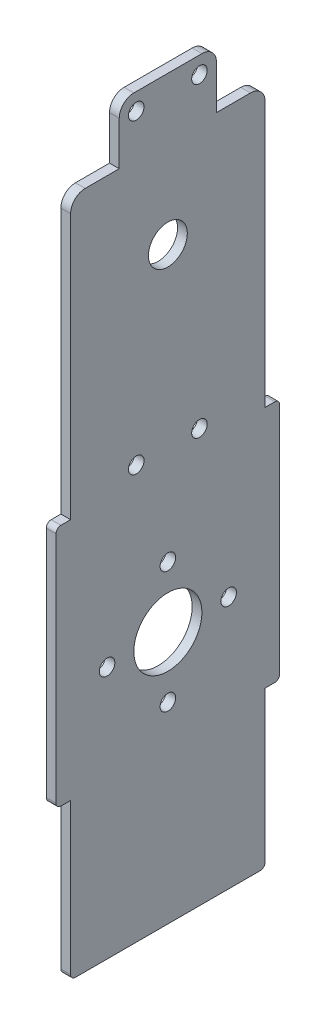
ISO-10303-21;
HEADER;
FILE_DESCRIPTION(('STEP AP214'),'2;1');
FILE_NAME('part.step','',(''),(''),'','','');
FILE_SCHEMA(('AUTOMOTIVE_DESIGN { 1 0 10303 214 1 1 1 1 }'));
ENDSEC;
DATA;
#1=APPLICATION_CONTEXT('core data for automotive mechanical design processes');
#2=APPLICATION_PROTOCOL_DEFINITION('international standard','automotive_design',2000,#1);
#3=PRODUCT_CONTEXT('',#1,'mechanical');
#4=PRODUCT('Part','Part','',(#3));
#5=PRODUCT_RELATED_PRODUCT_CATEGORY('part','',(#4));
#6=PRODUCT_DEFINITION_FORMATION('','',#4);
#7=PRODUCT_DEFINITION_CONTEXT('part definition',#1,'design');
#8=PRODUCT_DEFINITION('design','',#6,#7);
#9=PRODUCT_DEFINITION_SHAPE('','',#8);
#10=(LENGTH_UNIT() NAMED_UNIT(*) SI_UNIT(.MILLI.,.METRE.));
#11=(NAMED_UNIT(*) PLANE_ANGLE_UNIT() SI_UNIT($,.RADIAN.));
#12=(NAMED_UNIT(*) SI_UNIT($,.STERADIAN.) SOLID_ANGLE_UNIT());
#13=UNCERTAINTY_MEASURE_WITH_UNIT(LENGTH_MEASURE(1.E-05),#10,'distance_accuracy_value','');
#14=(GEOMETRIC_REPRESENTATION_CONTEXT(3) GLOBAL_UNCERTAINTY_ASSIGNED_CONTEXT((#13)) GLOBAL_UNIT_ASSIGNED_CONTEXT((#10,
#11,#12)) REPRESENTATION_CONTEXT('',''));
#15=CARTESIAN_POINT('',(0.,0.,0.));
#16=DIRECTION('',(0.,0.,1.));
#17=DIRECTION('',(1.,0.,0.));
#18=AXIS2_PLACEMENT_3D('',#15,#16,#17);
#19=CARTESIAN_POINT('',(2.,-69.75,0.));
#20=DIRECTION('',(0.,1.,0.));
#21=DIRECTION('',(0.,0.,1.));
#22=AXIS2_PLACEMENT_3D('',#19,#20,#21);
#23=PLANE('',#22);
#24=DIRECTION('',(0.,0.,-1.));
#25=VECTOR('',#24,1.);
#26=CARTESIAN_POINT('',(0.,-69.75,0.));
#27=LINE('',#26,#25);
#28=CARTESIAN_POINT('',(0.,-69.75,19.));
#29=VERTEX_POINT('',#28);
#30=CARTESIAN_POINT('',(0.,-69.75,-19.));
#31=VERTEX_POINT('',#30);
#32=EDGE_CURVE('E301',#29,#31,#27,.T.);
#33=ORIENTED_EDGE('',*,*,#32,.T.);
#34=DIRECTION('',(-1.,0.,0.));
#35=VECTOR('',#34,1.);
#36=CARTESIAN_POINT('',(2.,-69.75,-19.));
#37=LINE('',#36,#35);
#38=CARTESIAN_POINT('',(2.,-69.75,-19.));
#39=VERTEX_POINT('',#38);
#40=EDGE_CURVE('E412',#31,#39,#37,.F.);
#41=ORIENTED_EDGE('',*,*,#40,.T.);
#42=DIRECTION('',(0.,0.,-1.));
#43=VECTOR('',#42,1.);
#44=CARTESIAN_POINT('',(2.,-69.75,0.));
#45=LINE('',#44,#43);
#46=CARTESIAN_POINT('',(2.,-69.75,19.));
#47=VERTEX_POINT('',#46);
#48=EDGE_CURVE('E221',#47,#39,#45,.T.);
#49=ORIENTED_EDGE('',*,*,#48,.F.);
#50=DIRECTION('',(-1.,0.,0.));
#51=VECTOR('',#50,1.);
#52=CARTESIAN_POINT('',(0.,-69.75,19.));
#53=LINE('',#52,#51);
#54=EDGE_CURVE('E409',#47,#29,#53,.T.);
#55=ORIENTED_EDGE('',*,*,#54,.T.);
#56=EDGE_LOOP('',(#33,#41,#49,#55));
#57=FACE_BOUND('',#56,.T.);
#58=ADVANCED_FACE('F37',(#57),#23,.F.);
#59=CARTESIAN_POINT('',(2.,0.,-20.));
#60=DIRECTION('',(0.,0.,1.));
#61=DIRECTION('',(1.,0.,0.));
#62=AXIS2_PLACEMENT_3D('',#59,#60,#61);
#63=PLANE('',#62);
#64=DIRECTION('',(0.,1.,0.));
#65=VECTOR('',#64,1.);
#66=CARTESIAN_POINT('',(2.,0.,-20.));
#67=LINE('',#66,#65);
#68=CARTESIAN_POINT('',(2.,-68.75,-20.));
#69=VERTEX_POINT('',#68);
#70=CARTESIAN_POINT('',(2.,-37.75,-20.));
#71=VERTEX_POINT('',#70);
#72=EDGE_CURVE('E209',#69,#71,#67,.T.);
#73=ORIENTED_EDGE('',*,*,#72,.F.);
#74=DIRECTION('',(-1.,0.,0.));
#75=VECTOR('',#74,1.);
#76=CARTESIAN_POINT('',(2.,-68.75,-20.));
#77=LINE('',#76,#75);
#78=CARTESIAN_POINT('',(0.,-68.75,-20.));
#79=VERTEX_POINT('',#78);
#80=EDGE_CURVE('E395',#69,#79,#77,.T.);
#81=ORIENTED_EDGE('',*,*,#80,.T.);
#82=DIRECTION('',(0.,1.,0.));
#83=VECTOR('',#82,1.);
#84=CARTESIAN_POINT('',(0.,0.,-20.));
#85=LINE('',#84,#83);
#86=CARTESIAN_POINT('',(0.,-37.75,-20.));
#87=VERTEX_POINT('',#86);
#88=EDGE_CURVE('E228',#79,#87,#85,.T.);
#89=ORIENTED_EDGE('',*,*,#88,.T.);
#90=DIRECTION('',(-1.,0.,0.));
#91=VECTOR('',#90,1.);
#92=CARTESIAN_POINT('',(2.,-37.75,-20.));
#93=LINE('',#92,#91);
#94=EDGE_CURVE('E225',#71,#87,#93,.T.);
#95=ORIENTED_EDGE('',*,*,#94,.F.);
#96=EDGE_LOOP('',(#73,#81,#89,#95));
#97=FACE_BOUND('',#96,.T.);
#98=ADVANCED_FACE('F226',(#97),#63,.F.);
#99=CARTESIAN_POINT('',(2.,-37.75,0.));
#100=DIRECTION('',(0.,1.,0.));
#101=DIRECTION('',(0.,0.,1.));
#102=AXIS2_PLACEMENT_3D('',#99,#100,#101);
#103=PLANE('',#102);
#104=DIRECTION('',(0.,0.,-1.));
#105=VECTOR('',#104,1.);
#106=CARTESIAN_POINT('',(0.,-37.75,0.));
#107=LINE('',#106,#105);
#108=CARTESIAN_POINT('',(0.,-37.75,-22.));
#109=VERTEX_POINT('',#108);
#110=EDGE_CURVE('E305',#87,#109,#107,.T.);
#111=ORIENTED_EDGE('',*,*,#110,.T.);
#112=DIRECTION('',(-1.,0.,0.));
#113=VECTOR('',#112,1.);
#114=CARTESIAN_POINT('',(2.,-37.75,-22.));
#115=LINE('',#114,#113);
#116=CARTESIAN_POINT('',(2.,-37.75,-22.));
#117=VERTEX_POINT('',#116);
#118=EDGE_CURVE('E237',#109,#117,#115,.F.);
#119=ORIENTED_EDGE('',*,*,#118,.T.);
#120=DIRECTION('',(0.,0.,-1.));
#121=VECTOR('',#120,1.);
#122=CARTESIAN_POINT('',(2.,-37.75,0.));
#123=LINE('',#122,#121);
#124=EDGE_CURVE('E215',#71,#117,#123,.T.);
#125=ORIENTED_EDGE('',*,*,#124,.F.);
#126=ORIENTED_EDGE('',*,*,#94,.T.);
#127=EDGE_LOOP('',(#111,#119,#125,#126));
#128=FACE_BOUND('',#127,.T.);
#129=ADVANCED_FACE('F235',(#128),#103,.F.);
#130=CARTESIAN_POINT('',(2.,0.,-23.));
#131=DIRECTION('',(0.,0.,-1.));
#132=DIRECTION('',(-1.,0.,0.));
#133=AXIS2_PLACEMENT_3D('',#130,#131,#132);
#134=PLANE('',#133);
#135=DIRECTION('',(0.,-1.,0.));
#136=VECTOR('',#135,1.);
#137=CARTESIAN_POINT('',(0.,0.,-23.));
#138=LINE('',#137,#136);
#139=CARTESIAN_POINT('',(0.,11.25,-23.));
#140=VERTEX_POINT('',#139);
#141=CARTESIAN_POINT('',(0.,-36.75,-23.));
#142=VERTEX_POINT('',#141);
#143=EDGE_CURVE('E308',#140,#142,#138,.T.);
#144=ORIENTED_EDGE('',*,*,#143,.F.);
#145=DIRECTION('',(-1.,0.,0.));
#146=VECTOR('',#145,1.);
#147=CARTESIAN_POINT('',(2.,11.25,-23.));
#148=LINE('',#147,#146);
#149=CARTESIAN_POINT('',(2.,11.25,-23.));
#150=VERTEX_POINT('',#149);
#151=EDGE_CURVE('E431',#140,#150,#148,.F.);
#152=ORIENTED_EDGE('',*,*,#151,.T.);
#153=DIRECTION('',(0.,-1.,0.));
#154=VECTOR('',#153,1.);
#155=CARTESIAN_POINT('',(2.,0.,-23.));
#156=LINE('',#155,#154);
#157=CARTESIAN_POINT('',(2.,-36.75,-23.));
#158=VERTEX_POINT('',#157);
#159=EDGE_CURVE('E238',#150,#158,#156,.T.);
#160=ORIENTED_EDGE('',*,*,#159,.T.);
#161=DIRECTION('',(-1.,0.,0.));
#162=VECTOR('',#161,1.);
#163=CARTESIAN_POINT('',(0.,-36.75,-23.));
#164=LINE('',#163,#162);
#165=EDGE_CURVE('E428',#158,#142,#164,.T.);
#166=ORIENTED_EDGE('',*,*,#165,.T.);
#167=EDGE_LOOP('',(#144,#152,#160,#166));
#168=FACE_BOUND('',#167,.T.);
#169=ADVANCED_FACE('F650',(#168),#134,.T.);
#170=CARTESIAN_POINT('',(2.,12.25,0.));
#171=DIRECTION('',(0.,1.,0.));
#172=DIRECTION('',(0.,0.,1.));
#173=AXIS2_PLACEMENT_3D('',#170,#171,#172);
#174=PLANE('',#173);
#175=DIRECTION('',(0.,0.,-1.));
#176=VECTOR('',#175,1.);
#177=CARTESIAN_POINT('',(2.,12.25,0.));
#178=LINE('',#177,#176);
#179=CARTESIAN_POINT('',(2.,12.25,-20.));
#180=VERTEX_POINT('',#179);
#181=CARTESIAN_POINT('',(2.,12.25,-22.));
#182=VERTEX_POINT('',#181);
#183=EDGE_CURVE('E240',#180,#182,#178,.T.);
#184=ORIENTED_EDGE('',*,*,#183,.T.);
#185=DIRECTION('',(-1.,0.,0.));
#186=VECTOR('',#185,1.);
#187=CARTESIAN_POINT('',(2.,12.25,-22.));
#188=LINE('',#187,#186);
#189=CARTESIAN_POINT('',(0.,12.25,-22.));
#190=VERTEX_POINT('',#189);
#191=EDGE_CURVE('E425',#182,#190,#188,.T.);
#192=ORIENTED_EDGE('',*,*,#191,.T.);
#193=DIRECTION('',(0.,0.,-1.));
#194=VECTOR('',#193,1.);
#195=CARTESIAN_POINT('',(0.,12.25,0.));
#196=LINE('',#195,#194);
#197=CARTESIAN_POINT('',(0.,12.25,-20.));
#198=VERTEX_POINT('',#197);
#199=EDGE_CURVE('E311',#198,#190,#196,.T.);
#200=ORIENTED_EDGE('',*,*,#199,.F.);
#201=DIRECTION('',(-1.,0.,0.));
#202=VECTOR('',#201,1.);
#203=CARTESIAN_POINT('',(2.,12.25,-20.));
#204=LINE('',#203,#202);
#205=EDGE_CURVE('E233',#180,#198,#204,.T.);
#206=ORIENTED_EDGE('',*,*,#205,.F.);
#207=EDGE_LOOP('',(#184,#192,#200,#206));
#208=FACE_BOUND('',#207,.T.);
#209=ADVANCED_FACE('F646',(#208),#174,.T.);
#210=CARTESIAN_POINT('',(0.,66.75,-20.));
#211=VERTEX_POINT('',#210);
#212=EDGE_CURVE('E306',#198,#211,#85,.T.);
#213=ORIENTED_EDGE('',*,*,#212,.T.);
#214=DIRECTION('',(-1.,0.,0.));
#215=VECTOR('',#214,1.);
#216=CARTESIAN_POINT('',(2.,66.75,-20.));
#217=LINE('',#216,#215);
#218=CARTESIAN_POINT('',(2.,66.75,-20.));
#219=VERTEX_POINT('',#218);
#220=EDGE_CURVE('E388',#211,#219,#217,.F.);
#221=ORIENTED_EDGE('',*,*,#220,.T.);
#222=EDGE_CURVE('E223',#180,#219,#67,.T.);
#223=ORIENTED_EDGE('',*,*,#222,.F.);
#224=ORIENTED_EDGE('',*,*,#205,.T.);
#225=EDGE_LOOP('',(#213,#221,#223,#224));
#226=FACE_BOUND('',#225,.T.);
#227=ADVANCED_FACE('F541',(#226),#63,.F.);
#228=CARTESIAN_POINT('',(2.,69.75,0.));
#229=DIRECTION('',(0.,1.,0.));
#230=DIRECTION('',(0.,0.,1.));
#231=AXIS2_PLACEMENT_3D('',#228,#229,#230);
#232=PLANE('',#231);
#233=DIRECTION('',(0.,0.,-1.));
#234=VECTOR('',#233,1.);
#235=CARTESIAN_POINT('',(2.,69.75,0.));
#236=LINE('',#235,#234);
#237=CARTESIAN_POINT('',(2.,69.75,-10.));
#238=VERTEX_POINT('',#237);
#239=CARTESIAN_POINT('',(2.,69.75,-17.));
#240=VERTEX_POINT('',#239);
#241=EDGE_CURVE('E245',#238,#240,#236,.T.);
#242=ORIENTED_EDGE('',*,*,#241,.T.);
#243=DIRECTION('',(-1.,0.,0.));
#244=VECTOR('',#243,1.);
#245=CARTESIAN_POINT('',(0.,69.75,-17.));
#246=LINE('',#245,#244);
#247=CARTESIAN_POINT('',(0.,69.75,-17.));
#248=VERTEX_POINT('',#247);
#249=EDGE_CURVE('E385',#240,#248,#246,.T.);
#250=ORIENTED_EDGE('',*,*,#249,.T.);
#251=DIRECTION('',(0.,0.,-1.));
#252=VECTOR('',#251,1.);
#253=CARTESIAN_POINT('',(0.,69.75,0.));
#254=LINE('',#253,#252);
#255=CARTESIAN_POINT('',(0.,69.75,-10.));
#256=VERTEX_POINT('',#255);
#257=EDGE_CURVE('E314',#256,#248,#254,.T.);
#258=ORIENTED_EDGE('',*,*,#257,.F.);
#259=DIRECTION('',(-1.,0.,0.));
#260=VECTOR('',#259,1.);
#261=CARTESIAN_POINT('',(2.,69.75,-10.));
#262=LINE('',#261,#260);
#263=EDGE_CURVE('E356',#238,#256,#262,.T.);
#264=ORIENTED_EDGE('',*,*,#263,.F.);
#265=EDGE_LOOP('',(#242,#250,#258,#264));
#266=FACE_BOUND('',#265,.T.);
#267=ADVANCED_FACE('F634',(#266),#232,.T.);
#268=CARTESIAN_POINT('',(2.,0.,-10.));
#269=DIRECTION('',(0.,0.,-1.));
#270=DIRECTION('',(-1.,0.,0.));
#271=AXIS2_PLACEMENT_3D('',#268,#269,#270);
#272=PLANE('',#271);
#273=DIRECTION('',(0.,-1.,0.));
#274=VECTOR('',#273,1.);
#275=CARTESIAN_POINT('',(0.,0.,-10.));
#276=LINE('',#275,#274);
#277=CARTESIAN_POINT('',(0.,78.75,-10.));
#278=VERTEX_POINT('',#277);
#279=EDGE_CURVE('E317',#278,#256,#276,.T.);
#280=ORIENTED_EDGE('',*,*,#279,.F.);
#281=DIRECTION('',(-1.,0.,0.));
#282=VECTOR('',#281,1.);
#283=CARTESIAN_POINT('',(2.,78.75,-10.));
#284=LINE('',#283,#282);
#285=CARTESIAN_POINT('',(2.,78.75,-10.));
#286=VERTEX_POINT('',#285);
#287=EDGE_CURVE('E383',#278,#286,#284,.F.);
#288=ORIENTED_EDGE('',*,*,#287,.T.);
#289=DIRECTION('',(0.,-1.,0.));
#290=VECTOR('',#289,1.);
#291=CARTESIAN_POINT('',(2.,0.,-10.));
#292=LINE('',#291,#290);
#293=EDGE_CURVE('E248',#286,#238,#292,.T.);
#294=ORIENTED_EDGE('',*,*,#293,.T.);
#295=ORIENTED_EDGE('',*,*,#263,.T.);
#296=EDGE_LOOP('',(#280,#288,#294,#295));
#297=FACE_BOUND('',#296,.T.);
#298=ADVANCED_FACE('F628',(#297),#272,.T.);
#299=CARTESIAN_POINT('',(2.,81.75,0.));
#300=DIRECTION('',(0.,1.,0.));
#301=DIRECTION('',(0.,0.,1.));
#302=AXIS2_PLACEMENT_3D('',#299,#300,#301);
#303=PLANE('',#302);
#304=DIRECTION('',(0.,0.,-1.));
#305=VECTOR('',#304,1.);
#306=CARTESIAN_POINT('',(0.,81.75,0.));
#307=LINE('',#306,#305);
#308=CARTESIAN_POINT('',(0.,81.75,7.));
#309=VERTEX_POINT('',#308);
#310=CARTESIAN_POINT('',(0.,81.75,-7.));
#311=VERTEX_POINT('',#310);
#312=EDGE_CURVE('E320',#309,#311,#307,.T.);
#313=ORIENTED_EDGE('',*,*,#312,.F.);
#314=DIRECTION('',(-1.,0.,0.));
#315=VECTOR('',#314,1.);
#316=CARTESIAN_POINT('',(2.,81.75,7.));
#317=LINE('',#316,#315);
#318=CARTESIAN_POINT('',(2.,81.75,7.));
#319=VERTEX_POINT('',#318);
#320=EDGE_CURVE('E373',#309,#319,#317,.F.);
#321=ORIENTED_EDGE('',*,*,#320,.T.);
#322=DIRECTION('',(0.,0.,-1.));
#323=VECTOR('',#322,1.);
#324=CARTESIAN_POINT('',(2.,81.75,0.));
#325=LINE('',#324,#323);
#326=CARTESIAN_POINT('',(2.,81.75,-7.));
#327=VERTEX_POINT('',#326);
#328=EDGE_CURVE('E251',#319,#327,#325,.T.);
#329=ORIENTED_EDGE('',*,*,#328,.T.);
#330=DIRECTION('',(-1.,0.,0.));
#331=VECTOR('',#330,1.);
#332=CARTESIAN_POINT('',(2.,81.75,-7.));
#333=LINE('',#332,#331);
#334=EDGE_CURVE('E370',#327,#311,#333,.T.);
#335=ORIENTED_EDGE('',*,*,#334,.T.);
#336=EDGE_LOOP('',(#313,#321,#329,#335));
#337=FACE_BOUND('',#336,.T.);
#338=ADVANCED_FACE('F622',(#337),#303,.T.);
#339=CARTESIAN_POINT('',(2.,0.,9.99999999999999));
#340=DIRECTION('',(0.,0.,-1.));
#341=DIRECTION('',(0.,1.,0.));
#342=AXIS2_PLACEMENT_3D('',#339,#340,#341);
#343=PLANE('',#342);
#344=DIRECTION('',(0.,-1.,0.));
#345=VECTOR('',#344,1.);
#346=CARTESIAN_POINT('',(2.,0.,9.99999999999999));
#347=LINE('',#346,#345);
#348=CARTESIAN_POINT('',(2.,78.75,10.));
#349=VERTEX_POINT('',#348);
#350=CARTESIAN_POINT('',(2.,69.75,10.));
#351=VERTEX_POINT('',#350);
#352=EDGE_CURVE('E254',#349,#351,#347,.T.);
#353=ORIENTED_EDGE('',*,*,#352,.F.);
#354=DIRECTION('',(-1.,0.,0.));
#355=VECTOR('',#354,1.);
#356=CARTESIAN_POINT('',(0.,78.75,10.));
#357=LINE('',#356,#355);
#358=CARTESIAN_POINT('',(0.,78.75,10.));
#359=VERTEX_POINT('',#358);
#360=EDGE_CURVE('E232',#349,#359,#357,.T.);
#361=ORIENTED_EDGE('',*,*,#360,.T.);
#362=DIRECTION('',(0.,-1.,0.));
#363=VECTOR('',#362,1.);
#364=CARTESIAN_POINT('',(0.,0.,9.99999999999999));
#365=LINE('',#364,#363);
#366=CARTESIAN_POINT('',(0.,69.75,10.));
#367=VERTEX_POINT('',#366);
#368=EDGE_CURVE('E323',#359,#367,#365,.T.);
#369=ORIENTED_EDGE('',*,*,#368,.T.);
#370=DIRECTION('',(-1.,0.,0.));
#371=VECTOR('',#370,1.);
#372=CARTESIAN_POINT('',(2.,69.75,10.));
#373=LINE('',#372,#371);
#374=EDGE_CURVE('E353',#351,#367,#373,.T.);
#375=ORIENTED_EDGE('',*,*,#374,.F.);
#376=EDGE_LOOP('',(#353,#361,#369,#375));
#377=FACE_BOUND('',#376,.T.);
#378=ADVANCED_FACE('F618',(#377),#343,.F.);
#379=CARTESIAN_POINT('',(0.,69.75,17.));
#380=VERTEX_POINT('',#379);
#381=EDGE_CURVE('E318',#380,#367,#254,.T.);
#382=ORIENTED_EDGE('',*,*,#381,.F.);
#383=DIRECTION('',(-1.,0.,0.));
#384=VECTOR('',#383,1.);
#385=CARTESIAN_POINT('',(2.,69.75,17.));
#386=LINE('',#385,#384);
#387=CARTESIAN_POINT('',(2.,69.75,17.));
#388=VERTEX_POINT('',#387);
#389=EDGE_CURVE('E393',#380,#388,#386,.F.);
#390=ORIENTED_EDGE('',*,*,#389,.T.);
#391=EDGE_CURVE('E249',#388,#351,#236,.T.);
#392=ORIENTED_EDGE('',*,*,#391,.T.);
#393=ORIENTED_EDGE('',*,*,#374,.T.);
#394=EDGE_LOOP('',(#382,#390,#392,#393));
#395=FACE_BOUND('',#394,.T.);
#396=ADVANCED_FACE('F609',(#395),#232,.T.);
#397=CARTESIAN_POINT('',(2.,0.,20.));
#398=DIRECTION('',(0.,0.,1.));
#399=DIRECTION('',(1.,0.,0.));
#400=AXIS2_PLACEMENT_3D('',#397,#398,#399);
#401=PLANE('',#400);
#402=DIRECTION('',(0.,1.,0.));
#403=VECTOR('',#402,1.);
#404=CARTESIAN_POINT('',(2.,0.,20.));
#405=LINE('',#404,#403);
#406=CARTESIAN_POINT('',(2.,12.25,20.));
#407=VERTEX_POINT('',#406);
#408=CARTESIAN_POINT('',(2.,66.75,20.));
#409=VERTEX_POINT('',#408);
#410=EDGE_CURVE('E257',#407,#409,#405,.T.);
#411=ORIENTED_EDGE('',*,*,#410,.T.);
#412=DIRECTION('',(-1.,0.,0.));
#413=VECTOR('',#412,1.);
#414=CARTESIAN_POINT('',(2.,66.75,20.));
#415=LINE('',#414,#413);
#416=CARTESIAN_POINT('',(0.,66.75,20.));
#417=VERTEX_POINT('',#416);
#418=EDGE_CURVE('E390',#409,#417,#415,.T.);
#419=ORIENTED_EDGE('',*,*,#418,.T.);
#420=DIRECTION('',(0.,1.,0.));
#421=VECTOR('',#420,1.);
#422=CARTESIAN_POINT('',(0.,0.,20.));
#423=LINE('',#422,#421);
#424=CARTESIAN_POINT('',(0.,12.25,20.));
#425=VERTEX_POINT('',#424);
#426=EDGE_CURVE('E326',#425,#417,#423,.T.);
#427=ORIENTED_EDGE('',*,*,#426,.F.);
#428=DIRECTION('',(-1.,0.,0.));
#429=VECTOR('',#428,1.);
#430=CARTESIAN_POINT('',(2.,12.25,20.));
#431=LINE('',#430,#429);
#432=EDGE_CURVE('E351',#407,#425,#431,.T.);
#433=ORIENTED_EDGE('',*,*,#432,.F.);
#434=EDGE_LOOP('',(#411,#419,#427,#433));
#435=FACE_BOUND('',#434,.T.);
#436=ADVANCED_FACE('F603',(#435),#401,.T.);
#437=CARTESIAN_POINT('',(2.,12.25,0.));
#438=DIRECTION('',(0.,-1.,0.));
#439=DIRECTION('',(0.,0.,-1.));
#440=AXIS2_PLACEMENT_3D('',#437,#438,#439);
#441=PLANE('',#440);
#442=DIRECTION('',(0.,0.,1.));
#443=VECTOR('',#442,1.);
#444=CARTESIAN_POINT('',(0.,12.25,0.));
#445=LINE('',#444,#443);
#446=CARTESIAN_POINT('',(0.,12.25,22.));
#447=VERTEX_POINT('',#446);
#448=EDGE_CURVE('E329',#425,#447,#445,.T.);
#449=ORIENTED_EDGE('',*,*,#448,.T.);
#450=DIRECTION('',(-1.,0.,0.));
#451=VECTOR('',#450,1.);
#452=CARTESIAN_POINT('',(2.,12.25,22.));
#453=LINE('',#452,#451);
#454=CARTESIAN_POINT('',(2.,12.25,22.));
#455=VERTEX_POINT('',#454);
#456=EDGE_CURVE('E11',#447,#455,#453,.F.);
#457=ORIENTED_EDGE('',*,*,#456,.T.);
#458=DIRECTION('',(0.,0.,1.));
#459=VECTOR('',#458,1.);
#460=CARTESIAN_POINT('',(2.,12.25,0.));
#461=LINE('',#460,#459);
#462=EDGE_CURVE('E260',#407,#455,#461,.T.);
#463=ORIENTED_EDGE('',*,*,#462,.F.);
#464=ORIENTED_EDGE('',*,*,#432,.T.);
#465=EDGE_LOOP('',(#449,#457,#463,#464));
#466=FACE_BOUND('',#465,.T.);
#467=ADVANCED_FACE('F599',(#466),#441,.F.);
#468=CARTESIAN_POINT('',(2.,0.,23.));
#469=DIRECTION('',(0.,0.,-1.));
#470=DIRECTION('',(0.,1.,0.));
#471=AXIS2_PLACEMENT_3D('',#468,#469,#470);
#472=PLANE('',#471);
#473=DIRECTION('',(0.,-1.,0.));
#474=VECTOR('',#473,1.);
#475=CARTESIAN_POINT('',(0.,0.,23.));
#476=LINE('',#475,#474);
#477=CARTESIAN_POINT('',(0.,11.25,23.));
#478=VERTEX_POINT('',#477);
#479=CARTESIAN_POINT('',(0.,-36.75,23.));
#480=VERTEX_POINT('',#479);
#481=EDGE_CURVE('E333',#478,#480,#476,.T.);
#482=ORIENTED_EDGE('',*,*,#481,.T.);
#483=DIRECTION('',(-1.,0.,0.));
#484=VECTOR('',#483,1.);
#485=CARTESIAN_POINT('',(2.,-36.75,23.));
#486=LINE('',#485,#484);
#487=CARTESIAN_POINT('',(2.,-36.75,23.));
#488=VERTEX_POINT('',#487);
#489=EDGE_CURVE('E45',#480,#488,#486,.F.);
#490=ORIENTED_EDGE('',*,*,#489,.T.);
#491=DIRECTION('',(0.,-1.,0.));
#492=VECTOR('',#491,1.);
#493=CARTESIAN_POINT('',(2.,0.,23.));
#494=LINE('',#493,#492);
#495=CARTESIAN_POINT('',(2.,11.25,23.));
#496=VERTEX_POINT('',#495);
#497=EDGE_CURVE('E264',#496,#488,#494,.T.);
#498=ORIENTED_EDGE('',*,*,#497,.F.);
#499=DIRECTION('',(-1.,0.,0.));
#500=VECTOR('',#499,1.);
#501=CARTESIAN_POINT('',(2.,11.25,23.));
#502=LINE('',#501,#500);
#503=EDGE_CURVE('E437',#496,#478,#502,.T.);
#504=ORIENTED_EDGE('',*,*,#503,.T.);
#505=EDGE_LOOP('',(#482,#490,#498,#504));
#506=FACE_BOUND('',#505,.T.);
#507=ADVANCED_FACE('F442',(#506),#472,.F.);
#508=CARTESIAN_POINT('',(2.,-37.75,0.));
#509=DIRECTION('',(0.,-1.,0.));
#510=DIRECTION('',(0.,0.,-1.));
#511=AXIS2_PLACEMENT_3D('',#508,#509,#510);
#512=PLANE('',#511);
#513=DIRECTION('',(0.,0.,1.));
#514=VECTOR('',#513,1.);
#515=CARTESIAN_POINT('',(2.,-37.75,0.));
#516=LINE('',#515,#514);
#517=CARTESIAN_POINT('',(2.,-37.75,20.));
#518=VERTEX_POINT('',#517);
#519=CARTESIAN_POINT('',(2.,-37.75,22.));
#520=VERTEX_POINT('',#519);
#521=EDGE_CURVE('E267',#518,#520,#516,.T.);
#522=ORIENTED_EDGE('',*,*,#521,.T.);
#523=DIRECTION('',(-1.,0.,0.));
#524=VECTOR('',#523,1.);
#525=CARTESIAN_POINT('',(0.,-37.75,22.));
#526=LINE('',#525,#524);
#527=CARTESIAN_POINT('',(0.,-37.75,22.));
#528=VERTEX_POINT('',#527);
#529=EDGE_CURVE('E434',#520,#528,#526,.T.);
#530=ORIENTED_EDGE('',*,*,#529,.T.);
#531=DIRECTION('',(0.,0.,1.));
#532=VECTOR('',#531,1.);
#533=CARTESIAN_POINT('',(0.,-37.75,0.));
#534=LINE('',#533,#532);
#535=CARTESIAN_POINT('',(0.,-37.75,20.));
#536=VERTEX_POINT('',#535);
#537=EDGE_CURVE('E336',#536,#528,#534,.T.);
#538=ORIENTED_EDGE('',*,*,#537,.F.);
#539=DIRECTION('',(-1.,0.,0.));
#540=VECTOR('',#539,1.);
#541=CARTESIAN_POINT('',(2.,-37.75,20.));
#542=LINE('',#541,#540);
#543=EDGE_CURVE('E279',#518,#536,#542,.T.);
#544=ORIENTED_EDGE('',*,*,#543,.F.);
#545=EDGE_LOOP('',(#522,#530,#538,#544));
#546=FACE_BOUND('',#545,.T.);
#547=ADVANCED_FACE('F453',(#546),#512,.T.);
#548=CARTESIAN_POINT('',(2.,78.25,6.5));
#549=DIRECTION('',(-1.,0.,0.));
#550=DIRECTION('',(0.,0.,1.));
#551=AXIS2_PLACEMENT_3D('',#548,#549,#550);
#552=CYLINDRICAL_SURFACE('',#551,1.60000000000001);
#553=CARTESIAN_POINT('',(2.,78.25,6.5));
#554=DIRECTION('',(1.,0.,0.));
#555=DIRECTION('',(0.,0.,-1.));
#556=AXIS2_PLACEMENT_3D('',#553,#554,#555);
#557=CIRCLE('',#556,1.60000000000001);
#558=CARTESIAN_POINT('',(2.,78.25,4.9));
#559=VERTEX_POINT('',#558);
#560=EDGE_CURVE('E273',#559,#559,#557,.T.);
#561=ORIENTED_EDGE('',*,*,#560,.T.);
#562=EDGE_LOOP('',(#561));
#563=FACE_BOUND('',#562,.T.);
#564=CARTESIAN_POINT('',(0.,78.25,6.5));
#565=DIRECTION('',(1.,0.,0.));
#566=DIRECTION('',(0.,0.,-1.));
#567=AXIS2_PLACEMENT_3D('',#564,#565,#566);
#568=CIRCLE('',#567,1.60000000000001);
#569=CARTESIAN_POINT('',(0.,78.25,4.9));
#570=VERTEX_POINT('',#569);
#571=EDGE_CURVE('E342',#570,#570,#568,.T.);
#572=ORIENTED_EDGE('',*,*,#571,.F.);
#573=EDGE_LOOP('',(#572));
#574=FACE_BOUND('',#573,.T.);
#575=ADVANCED_FACE('F674',(#563,#574),#552,.F.);
#576=CARTESIAN_POINT('',(2.,78.25,-6.5));
#577=DIRECTION('',(-1.,0.,0.));
#578=DIRECTION('',(0.,0.,1.));
#579=AXIS2_PLACEMENT_3D('',#576,#577,#578);
#580=CYLINDRICAL_SURFACE('',#579,1.6);
#581=CARTESIAN_POINT('',(2.,78.25,-6.5));
#582=DIRECTION('',(1.,0.,0.));
#583=DIRECTION('',(0.,0.,-1.));
#584=AXIS2_PLACEMENT_3D('',#581,#582,#583);
#585=CIRCLE('',#584,1.6);
#586=CARTESIAN_POINT('',(2.,78.25,-8.1));
#587=VERTEX_POINT('',#586);
#588=EDGE_CURVE('E270',#587,#587,#585,.T.);
#589=ORIENTED_EDGE('',*,*,#588,.T.);
#590=EDGE_LOOP('',(#589));
#591=FACE_BOUND('',#590,.T.);
#592=CARTESIAN_POINT('',(0.,78.25,-6.5));
#593=DIRECTION('',(1.,0.,0.));
#594=DIRECTION('',(0.,0.,-1.));
#595=AXIS2_PLACEMENT_3D('',#592,#593,#594);
#596=CIRCLE('',#595,1.6);
#597=CARTESIAN_POINT('',(0.,78.25,-8.1));
#598=VERTEX_POINT('',#597);
#599=EDGE_CURVE('E339',#598,#598,#596,.T.);
#600=ORIENTED_EDGE('',*,*,#599,.F.);
#601=EDGE_LOOP('',(#600));
#602=FACE_BOUND('',#601,.T.);
#603=ADVANCED_FACE('F677',(#591,#602),#580,.F.);
#604=CARTESIAN_POINT('',(0.,-68.75,20.));
#605=VERTEX_POINT('',#604);
#606=EDGE_CURVE('E330',#605,#536,#423,.T.);
#607=ORIENTED_EDGE('',*,*,#606,.F.);
#608=DIRECTION('',(-1.,0.,0.));
#609=VECTOR('',#608,1.);
#610=CARTESIAN_POINT('',(2.,-68.75,20.));
#611=LINE('',#610,#609);
#612=CARTESIAN_POINT('',(2.,-68.75,20.));
#613=VERTEX_POINT('',#612);
#614=EDGE_CURVE('E423',#605,#613,#611,.F.);
#615=ORIENTED_EDGE('',*,*,#614,.T.);
#616=EDGE_CURVE('E261',#613,#518,#405,.T.);
#617=ORIENTED_EDGE('',*,*,#616,.T.);
#618=ORIENTED_EDGE('',*,*,#543,.T.);
#619=EDGE_LOOP('',(#607,#615,#617,#618));
#620=FACE_BOUND('',#619,.T.);
#621=ADVANCED_FACE('F462',(#620),#401,.T.);
#622=CARTESIAN_POINT('',(2.,-30.25,0.));
#623=DIRECTION('',(-1.,0.,0.));
#624=DIRECTION('',(0.,0.,1.));
#625=AXIS2_PLACEMENT_3D('',#622,#623,#624);
#626=CYLINDRICAL_SURFACE('',#625,1.6);
#627=CARTESIAN_POINT('',(2.,-30.25,0.));
#628=DIRECTION('',(1.,0.,0.));
#629=DIRECTION('',(0.,0.,-1.));
#630=AXIS2_PLACEMENT_3D('',#627,#628,#629);
#631=CIRCLE('',#630,1.6);
#632=CARTESIAN_POINT('',(2.,-30.25,-1.59999999999999));
#633=VERTEX_POINT('',#632);
#634=EDGE_CURVE('E473',#633,#633,#631,.T.);
#635=ORIENTED_EDGE('',*,*,#634,.T.);
#636=EDGE_LOOP('',(#635));
#637=FACE_BOUND('',#636,.T.);
#638=CARTESIAN_POINT('',(0.,-30.25,0.));
#639=DIRECTION('',(1.,0.,0.));
#640=DIRECTION('',(0.,0.,-1.));
#641=AXIS2_PLACEMENT_3D('',#638,#639,#640);
#642=CIRCLE('',#641,1.6);
#643=CARTESIAN_POINT('',(0.,-30.25,-1.59999999999999));
#644=VERTEX_POINT('',#643);
#645=EDGE_CURVE('E298',#644,#644,#642,.T.);
#646=ORIENTED_EDGE('',*,*,#645,.F.);
#647=EDGE_LOOP('',(#646));
#648=FACE_BOUND('',#647,.T.);
#649=ADVANCED_FACE('F514',(#637,#648),#626,.F.);
#650=CARTESIAN_POINT('',(2.,15.25,6.5));
#651=DIRECTION('',(-1.,0.,0.));
#652=DIRECTION('',(0.,0.,1.));
#653=AXIS2_PLACEMENT_3D('',#650,#651,#652);
#654=CYLINDRICAL_SURFACE('',#653,1.6);
#655=CARTESIAN_POINT('',(2.,15.25,6.5));
#656=DIRECTION('',(1.,0.,0.));
#657=DIRECTION('',(0.,0.,-1.));
#658=AXIS2_PLACEMENT_3D('',#655,#656,#657);
#659=CIRCLE('',#658,1.6);
#660=CARTESIAN_POINT('',(2.,15.25,4.9));
#661=VERTEX_POINT('',#660);
#662=EDGE_CURVE('E475',#661,#661,#659,.T.);
#663=ORIENTED_EDGE('',*,*,#662,.T.);
#664=EDGE_LOOP('',(#663));
#665=FACE_BOUND('',#664,.T.);
#666=CARTESIAN_POINT('',(0.,15.25,6.5));
#667=DIRECTION('',(1.,0.,0.));
#668=DIRECTION('',(0.,0.,-1.));
#669=AXIS2_PLACEMENT_3D('',#666,#667,#668);
#670=CIRCLE('',#669,1.6);
#671=CARTESIAN_POINT('',(0.,15.25,4.9));
#672=VERTEX_POINT('',#671);
#673=EDGE_CURVE('E295',#672,#672,#670,.T.);
#674=ORIENTED_EDGE('',*,*,#673,.F.);
#675=EDGE_LOOP('',(#674));
#676=FACE_BOUND('',#675,.T.);
#677=ADVANCED_FACE('F517',(#665,#676),#654,.F.);
#678=CARTESIAN_POINT('',(2.,15.25,-6.5));
#679=DIRECTION('',(-1.,0.,0.));
#680=DIRECTION('',(0.,0.,1.));
#681=AXIS2_PLACEMENT_3D('',#678,#679,#680);
#682=CYLINDRICAL_SURFACE('',#681,1.6);
#683=CARTESIAN_POINT('',(2.,15.25,-6.5));
#684=DIRECTION('',(1.,0.,0.));
#685=DIRECTION('',(0.,0.,-1.));
#686=AXIS2_PLACEMENT_3D('',#683,#684,#685);
#687=CIRCLE('',#686,1.6);
#688=CARTESIAN_POINT('',(2.,15.25,-8.1));
#689=VERTEX_POINT('',#688);
#690=EDGE_CURVE('E480',#689,#689,#687,.T.);
#691=ORIENTED_EDGE('',*,*,#690,.T.);
#692=EDGE_LOOP('',(#691));
#693=FACE_BOUND('',#692,.T.);
#694=CARTESIAN_POINT('',(0.,15.25,-6.5));
#695=DIRECTION('',(1.,0.,0.));
#696=DIRECTION('',(0.,0.,-1.));
#697=AXIS2_PLACEMENT_3D('',#694,#695,#696);
#698=CIRCLE('',#697,1.6);
#699=CARTESIAN_POINT('',(0.,15.25,-8.1));
#700=VERTEX_POINT('',#699);
#701=EDGE_CURVE('E292',#700,#700,#698,.T.);
#702=ORIENTED_EDGE('',*,*,#701,.F.);
#703=EDGE_LOOP('',(#702));
#704=FACE_BOUND('',#703,.T.);
#705=ADVANCED_FACE('F547',(#693,#704),#682,.F.);
#706=CARTESIAN_POINT('',(2.,51.25,0.));
#707=DIRECTION('',(-1.,0.,0.));
#708=DIRECTION('',(0.,0.,1.));
#709=AXIS2_PLACEMENT_3D('',#706,#707,#708);
#710=CYLINDRICAL_SURFACE('',#709,4.);
#711=CARTESIAN_POINT('',(2.,51.25,0.));
#712=DIRECTION('',(1.,0.,0.));
#713=DIRECTION('',(0.,0.,-1.));
#714=AXIS2_PLACEMENT_3D('',#711,#712,#713);
#715=CIRCLE('',#714,4.);
#716=CARTESIAN_POINT('',(2.,51.25,-4.));
#717=VERTEX_POINT('',#716);
#718=EDGE_CURVE('E483',#717,#717,#715,.T.);
#719=ORIENTED_EDGE('',*,*,#718,.T.);
#720=EDGE_LOOP('',(#719));
#721=FACE_BOUND('',#720,.T.);
#722=CARTESIAN_POINT('',(0.,51.25,0.));
#723=DIRECTION('',(1.,0.,0.));
#724=DIRECTION('',(0.,0.,-1.));
#725=AXIS2_PLACEMENT_3D('',#722,#723,#724);
#726=CIRCLE('',#725,4.);
#727=CARTESIAN_POINT('',(0.,51.25,-4.));
#728=VERTEX_POINT('',#727);
#729=EDGE_CURVE('E289',#728,#728,#726,.T.);
#730=ORIENTED_EDGE('',*,*,#729,.F.);
#731=EDGE_LOOP('',(#730));
#732=FACE_BOUND('',#731,.T.);
#733=ADVANCED_FACE('F551',(#721,#732),#710,.F.);
#734=CARTESIAN_POINT('',(2.,-17.75,-12.5));
#735=DIRECTION('',(-1.,0.,0.));
#736=DIRECTION('',(0.,0.,1.));
#737=AXIS2_PLACEMENT_3D('',#734,#735,#736);
#738=CYLINDRICAL_SURFACE('',#737,1.6);
#739=CARTESIAN_POINT('',(2.,-17.75,-12.5));
#740=DIRECTION('',(1.,0.,0.));
#741=DIRECTION('',(0.,0.,-1.));
#742=AXIS2_PLACEMENT_3D('',#739,#740,#741);
#743=CIRCLE('',#742,1.6);
#744=CARTESIAN_POINT('',(2.,-17.75,-14.1));
#745=VERTEX_POINT('',#744);
#746=EDGE_CURVE('E486',#745,#745,#743,.T.);
#747=ORIENTED_EDGE('',*,*,#746,.T.);
#748=EDGE_LOOP('',(#747));
#749=FACE_BOUND('',#748,.T.);
#750=CARTESIAN_POINT('',(0.,-17.75,-12.5));
#751=DIRECTION('',(1.,0.,0.));
#752=DIRECTION('',(0.,0.,-1.));
#753=AXIS2_PLACEMENT_3D('',#750,#751,#752);
#754=CIRCLE('',#753,1.6);
#755=CARTESIAN_POINT('',(0.,-17.75,-14.1));
#756=VERTEX_POINT('',#755);
#757=EDGE_CURVE('E286',#756,#756,#754,.T.);
#758=ORIENTED_EDGE('',*,*,#757,.F.);
#759=EDGE_LOOP('',(#758));
#760=FACE_BOUND('',#759,.T.);
#761=ADVANCED_FACE('F555',(#749,#760),#738,.F.);
#762=CARTESIAN_POINT('',(2.,-5.24999999999999,0.));
#763=DIRECTION('',(-1.,0.,0.));
#764=DIRECTION('',(0.,0.,1.));
#765=AXIS2_PLACEMENT_3D('',#762,#763,#764);
#766=CYLINDRICAL_SURFACE('',#765,1.6);
#767=CARTESIAN_POINT('',(2.,-5.24999999999999,0.));
#768=DIRECTION('',(1.,0.,0.));
#769=DIRECTION('',(0.,0.,-1.));
#770=AXIS2_PLACEMENT_3D('',#767,#768,#769);
#771=CIRCLE('',#770,1.6);
#772=CARTESIAN_POINT('',(2.,-5.24999999999999,-1.59999999999999));
#773=VERTEX_POINT('',#772);
#774=EDGE_CURVE('E489',#773,#773,#771,.T.);
#775=ORIENTED_EDGE('',*,*,#774,.T.);
#776=EDGE_LOOP('',(#775));
#777=FACE_BOUND('',#776,.T.);
#778=CARTESIAN_POINT('',(0.,-5.24999999999999,0.));
#779=DIRECTION('',(1.,0.,0.));
#780=DIRECTION('',(0.,0.,-1.));
#781=AXIS2_PLACEMENT_3D('',#778,#779,#780);
#782=CIRCLE('',#781,1.6);
#783=CARTESIAN_POINT('',(0.,-5.24999999999999,-1.59999999999999));
#784=VERTEX_POINT('',#783);
#785=EDGE_CURVE('E283',#784,#784,#782,.T.);
#786=ORIENTED_EDGE('',*,*,#785,.F.);
#787=EDGE_LOOP('',(#786));
#788=FACE_BOUND('',#787,.T.);
#789=ADVANCED_FACE('F559',(#777,#788),#766,.F.);
#790=CARTESIAN_POINT('',(2.,-17.75,12.5));
#791=DIRECTION('',(-1.,0.,0.));
#792=DIRECTION('',(0.,0.,1.));
#793=AXIS2_PLACEMENT_3D('',#790,#791,#792);
#794=CYLINDRICAL_SURFACE('',#793,1.6);
#795=CARTESIAN_POINT('',(2.,-17.75,12.5));
#796=DIRECTION('',(1.,0.,0.));
#797=DIRECTION('',(0.,0.,-1.));
#798=AXIS2_PLACEMENT_3D('',#795,#796,#797);
#799=CIRCLE('',#798,1.6);
#800=CARTESIAN_POINT('',(2.,-17.75,10.9));
#801=VERTEX_POINT('',#800);
#802=EDGE_CURVE('E348',#801,#801,#799,.T.);
#803=ORIENTED_EDGE('',*,*,#802,.T.);
#804=EDGE_LOOP('',(#803));
#805=FACE_BOUND('',#804,.T.);
#806=CARTESIAN_POINT('',(0.,-17.75,12.5));
#807=DIRECTION('',(1.,0.,0.));
#808=DIRECTION('',(0.,0.,-1.));
#809=AXIS2_PLACEMENT_3D('',#806,#807,#808);
#810=CIRCLE('',#809,1.6);
#811=CARTESIAN_POINT('',(0.,-17.75,10.9));
#812=VERTEX_POINT('',#811);
#813=EDGE_CURVE('E280',#812,#812,#810,.T.);
#814=ORIENTED_EDGE('',*,*,#813,.F.);
#815=EDGE_LOOP('',(#814));
#816=FACE_BOUND('',#815,.T.);
#817=ADVANCED_FACE('F495',(#805,#816),#794,.F.);
#818=CARTESIAN_POINT('',(2.,-17.75,0.));
#819=DIRECTION('',(-1.,0.,0.));
#820=DIRECTION('',(0.,0.,1.));
#821=AXIS2_PLACEMENT_3D('',#818,#819,#820);
#822=CYLINDRICAL_SURFACE('',#821,7.);
#823=CARTESIAN_POINT('',(2.,-17.75,0.));
#824=DIRECTION('',(1.,0.,0.));
#825=DIRECTION('',(0.,0.,-1.));
#826=AXIS2_PLACEMENT_3D('',#823,#824,#825);
#827=CIRCLE('',#826,7.);
#828=CARTESIAN_POINT('',(2.,-17.75,-6.99999999999999));
#829=VERTEX_POINT('',#828);
#830=EDGE_CURVE('E276',#829,#829,#827,.T.);
#831=ORIENTED_EDGE('',*,*,#830,.T.);
#832=EDGE_LOOP('',(#831));
#833=FACE_BOUND('',#832,.T.);
#834=CARTESIAN_POINT('',(0.,-17.75,0.));
#835=DIRECTION('',(1.,0.,0.));
#836=DIRECTION('',(0.,0.,-1.));
#837=AXIS2_PLACEMENT_3D('',#834,#835,#836);
#838=CIRCLE('',#837,7.);
#839=CARTESIAN_POINT('',(0.,-17.75,-6.99999999999999));
#840=VERTEX_POINT('',#839);
#841=EDGE_CURVE('E345',#840,#840,#838,.T.);
#842=ORIENTED_EDGE('',*,*,#841,.F.);
#843=EDGE_LOOP('',(#842));
#844=FACE_BOUND('',#843,.T.);
#845=ADVANCED_FACE('F500',(#833,#844),#822,.F.);
#846=CARTESIAN_POINT('',(2.,0.,0.));
#847=DIRECTION('',(1.,0.,0.));
#848=DIRECTION('',(0.,0.,-1.));
#849=AXIS2_PLACEMENT_3D('',#846,#847,#848);
#850=PLANE('',#849);
#851=ORIENTED_EDGE('',*,*,#802,.F.);
#852=EDGE_LOOP('',(#851));
#853=FACE_BOUND('',#852,.T.);
#854=ORIENTED_EDGE('',*,*,#774,.F.);
#855=EDGE_LOOP('',(#854));
#856=FACE_BOUND('',#855,.T.);
#857=ORIENTED_EDGE('',*,*,#746,.F.);
#858=EDGE_LOOP('',(#857));
#859=FACE_BOUND('',#858,.T.);
#860=ORIENTED_EDGE('',*,*,#718,.F.);
#861=EDGE_LOOP('',(#860));
#862=FACE_BOUND('',#861,.T.);
#863=ORIENTED_EDGE('',*,*,#690,.F.);
#864=EDGE_LOOP('',(#863));
#865=FACE_BOUND('',#864,.T.);
#866=ORIENTED_EDGE('',*,*,#662,.F.);
#867=EDGE_LOOP('',(#866));
#868=FACE_BOUND('',#867,.T.);
#869=ORIENTED_EDGE('',*,*,#634,.F.);
#870=EDGE_LOOP('',(#869));
#871=FACE_BOUND('',#870,.T.);
#872=ORIENTED_EDGE('',*,*,#48,.T.);
#873=CARTESIAN_POINT('',(2.,-68.75,-19.));
#874=DIRECTION('',(1.,0.,0.));
#875=DIRECTION('',(0.,0.,-1.));
#876=AXIS2_PLACEMENT_3D('',#873,#874,#875);
#877=CIRCLE('',#876,1.);
#878=EDGE_CURVE('E217',#39,#69,#877,.T.);
#879=ORIENTED_EDGE('',*,*,#878,.T.);
#880=ORIENTED_EDGE('',*,*,#72,.T.);
#881=ORIENTED_EDGE('',*,*,#124,.T.);
#882=CARTESIAN_POINT('',(2.,-36.75,-22.));
#883=DIRECTION('',(1.,0.,0.));
#884=DIRECTION('',(0.,0.,-1.));
#885=AXIS2_PLACEMENT_3D('',#882,#883,#884);
#886=CIRCLE('',#885,1.);
#887=EDGE_CURVE('E58',#117,#158,#886,.T.);
#888=ORIENTED_EDGE('',*,*,#887,.T.);
#889=ORIENTED_EDGE('',*,*,#159,.F.);
#890=CARTESIAN_POINT('',(2.,11.25,-22.));
#891=DIRECTION('',(1.,0.,0.));
#892=DIRECTION('',(0.,0.,-1.));
#893=AXIS2_PLACEMENT_3D('',#890,#891,#892);
#894=CIRCLE('',#893,1.);
#895=EDGE_CURVE('E52',#150,#182,#894,.T.);
#896=ORIENTED_EDGE('',*,*,#895,.T.);
#897=ORIENTED_EDGE('',*,*,#183,.F.);
#898=ORIENTED_EDGE('',*,*,#222,.T.);
#899=CARTESIAN_POINT('',(2.,66.75,-17.));
#900=DIRECTION('',(1.,0.,0.));
#901=DIRECTION('',(0.,0.,-1.));
#902=AXIS2_PLACEMENT_3D('',#899,#900,#901);
#903=CIRCLE('',#902,3.);
#904=EDGE_CURVE('E377',#219,#240,#903,.T.);
#905=ORIENTED_EDGE('',*,*,#904,.T.);
#906=ORIENTED_EDGE('',*,*,#241,.F.);
#907=ORIENTED_EDGE('',*,*,#293,.F.);
#908=CARTESIAN_POINT('',(2.,78.75,-7.));
#909=DIRECTION('',(1.,0.,0.));
#910=DIRECTION('',(0.,0.,-1.));
#911=AXIS2_PLACEMENT_3D('',#908,#909,#910);
#912=CIRCLE('',#911,3.);
#913=EDGE_CURVE('E379',#286,#327,#912,.T.);
#914=ORIENTED_EDGE('',*,*,#913,.T.);
#915=ORIENTED_EDGE('',*,*,#328,.F.);
#916=CARTESIAN_POINT('',(2.,78.75,7.));
#917=DIRECTION('',(1.,0.,0.));
#918=DIRECTION('',(0.,0.,-1.));
#919=AXIS2_PLACEMENT_3D('',#916,#917,#918);
#920=CIRCLE('',#919,3.);
#921=EDGE_CURVE('E381',#319,#349,#920,.T.);
#922=ORIENTED_EDGE('',*,*,#921,.T.);
#923=ORIENTED_EDGE('',*,*,#352,.T.);
#924=ORIENTED_EDGE('',*,*,#391,.F.);
#925=CARTESIAN_POINT('',(2.,66.75,17.));
#926=DIRECTION('',(1.,0.,0.));
#927=DIRECTION('',(0.,0.,-1.));
#928=AXIS2_PLACEMENT_3D('',#925,#926,#927);
#929=CIRCLE('',#928,3.);
#930=EDGE_CURVE('E375',#388,#409,#929,.T.);
#931=ORIENTED_EDGE('',*,*,#930,.T.);
#932=ORIENTED_EDGE('',*,*,#410,.F.);
#933=ORIENTED_EDGE('',*,*,#462,.T.);
#934=CARTESIAN_POINT('',(2.,11.25,22.));
#935=DIRECTION('',(1.,0.,0.));
#936=DIRECTION('',(0.,0.,-1.));
#937=AXIS2_PLACEMENT_3D('',#934,#935,#936);
#938=CIRCLE('',#937,1.);
#939=EDGE_CURVE('E414',#455,#496,#938,.T.);
#940=ORIENTED_EDGE('',*,*,#939,.T.);
#941=ORIENTED_EDGE('',*,*,#497,.T.);
#942=CARTESIAN_POINT('',(2.,-36.75,22.));
#943=DIRECTION('',(1.,0.,0.));
#944=DIRECTION('',(0.,0.,-1.));
#945=AXIS2_PLACEMENT_3D('',#942,#943,#944);
#946=CIRCLE('',#945,1.);
#947=EDGE_CURVE('E416',#488,#520,#946,.T.);
#948=ORIENTED_EDGE('',*,*,#947,.T.);
#949=ORIENTED_EDGE('',*,*,#521,.F.);
#950=ORIENTED_EDGE('',*,*,#616,.F.);
#951=CARTESIAN_POINT('',(2.,-68.75,19.));
#952=DIRECTION('',(1.,0.,0.));
#953=DIRECTION('',(0.,0.,-1.));
#954=AXIS2_PLACEMENT_3D('',#951,#952,#953);
#955=CIRCLE('',#954,1.);
#956=EDGE_CURVE('E420',#613,#47,#955,.T.);
#957=ORIENTED_EDGE('',*,*,#956,.T.);
#958=EDGE_LOOP('',(#872,#879,#880,#881,#888,#889,#896,#897,#898,#905,#906,#907,#914,#915,#922,
#923,#924,#931,#932,#933,#940,#941,#948,#949,#950,#957));
#959=FACE_BOUND('',#958,.T.);
#960=ORIENTED_EDGE('',*,*,#588,.F.);
#961=EDGE_LOOP('',(#960));
#962=FACE_BOUND('',#961,.T.);
#963=ORIENTED_EDGE('',*,*,#560,.F.);
#964=EDGE_LOOP('',(#963));
#965=FACE_BOUND('',#964,.T.);
#966=ORIENTED_EDGE('',*,*,#830,.F.);
#967=EDGE_LOOP('',(#966));
#968=FACE_BOUND('',#967,.T.);
#969=ADVANCED_FACE('F212',(#853,#856,#859,#862,#865,#868,#871,#959,#962,#965,#968),#850,.T.);
#970=CARTESIAN_POINT('',(0.,0.,0.));
#971=DIRECTION('',(1.,0.,0.));
#972=DIRECTION('',(0.,0.,-1.));
#973=AXIS2_PLACEMENT_3D('',#970,#971,#972);
#974=PLANE('',#973);
#975=ORIENTED_EDGE('',*,*,#813,.T.);
#976=EDGE_LOOP('',(#975));
#977=FACE_BOUND('',#976,.T.);
#978=ORIENTED_EDGE('',*,*,#785,.T.);
#979=EDGE_LOOP('',(#978));
#980=FACE_BOUND('',#979,.T.);
#981=ORIENTED_EDGE('',*,*,#757,.T.);
#982=EDGE_LOOP('',(#981));
#983=FACE_BOUND('',#982,.T.);
#984=ORIENTED_EDGE('',*,*,#729,.T.);
#985=EDGE_LOOP('',(#984));
#986=FACE_BOUND('',#985,.T.);
#987=ORIENTED_EDGE('',*,*,#701,.T.);
#988=EDGE_LOOP('',(#987));
#989=FACE_BOUND('',#988,.T.);
#990=ORIENTED_EDGE('',*,*,#673,.T.);
#991=EDGE_LOOP('',(#990));
#992=FACE_BOUND('',#991,.T.);
#993=ORIENTED_EDGE('',*,*,#645,.T.);
#994=EDGE_LOOP('',(#993));
#995=FACE_BOUND('',#994,.T.);
#996=ORIENTED_EDGE('',*,*,#88,.F.);
#997=CARTESIAN_POINT('',(0.,-68.75,-19.));
#998=DIRECTION('',(1.,0.,0.));
#999=DIRECTION('',(0.,0.,-1.));
#1000=AXIS2_PLACEMENT_3D('',#997,#998,#999);
#1001=CIRCLE('',#1000,1.);
#1002=EDGE_CURVE('E407',#79,#31,#1001,.F.);
#1003=ORIENTED_EDGE('',*,*,#1002,.T.);
#1004=ORIENTED_EDGE('',*,*,#32,.F.);
#1005=CARTESIAN_POINT('',(0.,-68.75,19.));
#1006=DIRECTION('',(1.,0.,0.));
#1007=DIRECTION('',(0.,0.,-1.));
#1008=AXIS2_PLACEMENT_3D('',#1005,#1006,#1007);
#1009=CIRCLE('',#1008,1.);
#1010=EDGE_CURVE('E405',#29,#605,#1009,.F.);
#1011=ORIENTED_EDGE('',*,*,#1010,.T.);
#1012=ORIENTED_EDGE('',*,*,#606,.T.);
#1013=ORIENTED_EDGE('',*,*,#537,.T.);
#1014=CARTESIAN_POINT('',(0.,-36.75,22.));
#1015=DIRECTION('',(1.,0.,0.));
#1016=DIRECTION('',(0.,0.,-1.));
#1017=AXIS2_PLACEMENT_3D('',#1014,#1015,#1016);
#1018=CIRCLE('',#1017,1.);
#1019=EDGE_CURVE('E399',#528,#480,#1018,.F.);
#1020=ORIENTED_EDGE('',*,*,#1019,.T.);
#1021=ORIENTED_EDGE('',*,*,#481,.F.);
#1022=CARTESIAN_POINT('',(0.,11.25,22.));
#1023=DIRECTION('',(1.,0.,0.));
#1024=DIRECTION('',(0.,0.,-1.));
#1025=AXIS2_PLACEMENT_3D('',#1022,#1023,#1024);
#1026=CIRCLE('',#1025,1.);
#1027=EDGE_CURVE('E397',#478,#447,#1026,.F.);
#1028=ORIENTED_EDGE('',*,*,#1027,.T.);
#1029=ORIENTED_EDGE('',*,*,#448,.F.);
#1030=ORIENTED_EDGE('',*,*,#426,.T.);
#1031=CARTESIAN_POINT('',(0.,66.75,17.));
#1032=DIRECTION('',(1.,0.,0.));
#1033=DIRECTION('',(0.,0.,-1.));
#1034=AXIS2_PLACEMENT_3D('',#1031,#1032,#1033);
#1035=CIRCLE('',#1034,3.);
#1036=EDGE_CURVE('E362',#417,#380,#1035,.F.);
#1037=ORIENTED_EDGE('',*,*,#1036,.T.);
#1038=ORIENTED_EDGE('',*,*,#381,.T.);
#1039=ORIENTED_EDGE('',*,*,#368,.F.);
#1040=CARTESIAN_POINT('',(0.,78.75,7.));
#1041=DIRECTION('',(1.,0.,0.));
#1042=DIRECTION('',(0.,0.,-1.));
#1043=AXIS2_PLACEMENT_3D('',#1040,#1041,#1042);
#1044=CIRCLE('',#1043,3.);
#1045=EDGE_CURVE('E368',#359,#309,#1044,.F.);
#1046=ORIENTED_EDGE('',*,*,#1045,.T.);
#1047=ORIENTED_EDGE('',*,*,#312,.T.);
#1048=CARTESIAN_POINT('',(0.,78.75,-7.));
#1049=DIRECTION('',(1.,0.,0.));
#1050=DIRECTION('',(0.,0.,-1.));
#1051=AXIS2_PLACEMENT_3D('',#1048,#1049,#1050);
#1052=CIRCLE('',#1051,3.);
#1053=EDGE_CURVE('E366',#311,#278,#1052,.F.);
#1054=ORIENTED_EDGE('',*,*,#1053,.T.);
#1055=ORIENTED_EDGE('',*,*,#279,.T.);
#1056=ORIENTED_EDGE('',*,*,#257,.T.);
#1057=CARTESIAN_POINT('',(0.,66.75,-17.));
#1058=DIRECTION('',(1.,0.,0.));
#1059=DIRECTION('',(0.,0.,-1.));
#1060=AXIS2_PLACEMENT_3D('',#1057,#1058,#1059);
#1061=CIRCLE('',#1060,3.);
#1062=EDGE_CURVE('E364',#248,#211,#1061,.F.);
#1063=ORIENTED_EDGE('',*,*,#1062,.T.);
#1064=ORIENTED_EDGE('',*,*,#212,.F.);
#1065=ORIENTED_EDGE('',*,*,#199,.T.);
#1066=CARTESIAN_POINT('',(0.,11.25,-22.));
#1067=DIRECTION('',(1.,0.,0.));
#1068=DIRECTION('',(0.,0.,-1.));
#1069=AXIS2_PLACEMENT_3D('',#1066,#1067,#1068);
#1070=CIRCLE('',#1069,1.);
#1071=EDGE_CURVE('E403',#190,#140,#1070,.F.);
#1072=ORIENTED_EDGE('',*,*,#1071,.T.);
#1073=ORIENTED_EDGE('',*,*,#143,.T.);
#1074=CARTESIAN_POINT('',(0.,-36.75,-22.));
#1075=DIRECTION('',(1.,0.,0.));
#1076=DIRECTION('',(0.,0.,-1.));
#1077=AXIS2_PLACEMENT_3D('',#1074,#1075,#1076);
#1078=CIRCLE('',#1077,1.);
#1079=EDGE_CURVE('E401',#142,#109,#1078,.F.);
#1080=ORIENTED_EDGE('',*,*,#1079,.T.);
#1081=ORIENTED_EDGE('',*,*,#110,.F.);
#1082=EDGE_LOOP('',(#996,#1003,#1004,#1011,#1012,#1013,#1020,#1021,#1028,#1029,#1030,#1037,
#1038,#1039,#1046,#1047,#1054,#1055,#1056,#1063,#1064,#1065,#1072,#1073,#1080,#1081));
#1083=FACE_BOUND('',#1082,.T.);
#1084=ORIENTED_EDGE('',*,*,#599,.T.);
#1085=EDGE_LOOP('',(#1084));
#1086=FACE_BOUND('',#1085,.T.);
#1087=ORIENTED_EDGE('',*,*,#571,.T.);
#1088=EDGE_LOOP('',(#1087));
#1089=FACE_BOUND('',#1088,.T.);
#1090=ORIENTED_EDGE('',*,*,#841,.T.);
#1091=EDGE_LOOP('',(#1090));
#1092=FACE_BOUND('',#1091,.T.);
#1093=ADVANCED_FACE('F456',(#977,#980,#983,#986,#989,#992,#995,#1083,#1086,#1089,#1092),#974,.F.);
#1094=CARTESIAN_POINT('',(2.,78.75,7.));
#1095=DIRECTION('',(1.,0.,0.));
#1096=DIRECTION('',(0.,0.,-1.));
#1097=AXIS2_PLACEMENT_3D('',#1094,#1095,#1096);
#1098=CYLINDRICAL_SURFACE('',#1097,3.);
#1099=ORIENTED_EDGE('',*,*,#921,.F.);
#1100=ORIENTED_EDGE('',*,*,#320,.F.);
#1101=ORIENTED_EDGE('',*,*,#1045,.F.);
#1102=ORIENTED_EDGE('',*,*,#360,.F.);
#1103=EDGE_LOOP('',(#1099,#1100,#1101,#1102));
#1104=FACE_BOUND('',#1103,.T.);
#1105=ADVANCED_FACE('F522',(#1104),#1098,.T.);
#1106=CARTESIAN_POINT('',(2.,78.75,-7.));
#1107=DIRECTION('',(-1.,0.,0.));
#1108=DIRECTION('',(0.,0.,1.));
#1109=AXIS2_PLACEMENT_3D('',#1106,#1107,#1108);
#1110=CYLINDRICAL_SURFACE('',#1109,3.);
#1111=ORIENTED_EDGE('',*,*,#913,.F.);
#1112=ORIENTED_EDGE('',*,*,#287,.F.);
#1113=ORIENTED_EDGE('',*,*,#1053,.F.);
#1114=ORIENTED_EDGE('',*,*,#334,.F.);
#1115=EDGE_LOOP('',(#1111,#1112,#1113,#1114));
#1116=FACE_BOUND('',#1115,.T.);
#1117=ADVANCED_FACE('F529',(#1116),#1110,.T.);
#1118=CARTESIAN_POINT('',(2.,66.75,-17.));
#1119=DIRECTION('',(1.,0.,0.));
#1120=DIRECTION('',(0.,0.,-1.));
#1121=AXIS2_PLACEMENT_3D('',#1118,#1119,#1120);
#1122=CYLINDRICAL_SURFACE('',#1121,3.);
#1123=ORIENTED_EDGE('',*,*,#904,.F.);
#1124=ORIENTED_EDGE('',*,*,#220,.F.);
#1125=ORIENTED_EDGE('',*,*,#1062,.F.);
#1126=ORIENTED_EDGE('',*,*,#249,.F.);
#1127=EDGE_LOOP('',(#1123,#1124,#1125,#1126));
#1128=FACE_BOUND('',#1127,.T.);
#1129=ADVANCED_FACE('F568',(#1128),#1122,.T.);
#1130=CARTESIAN_POINT('',(2.,66.75,17.));
#1131=DIRECTION('',(-1.,0.,0.));
#1132=DIRECTION('',(0.,0.,1.));
#1133=AXIS2_PLACEMENT_3D('',#1130,#1131,#1132);
#1134=CYLINDRICAL_SURFACE('',#1133,3.);
#1135=ORIENTED_EDGE('',*,*,#930,.F.);
#1136=ORIENTED_EDGE('',*,*,#389,.F.);
#1137=ORIENTED_EDGE('',*,*,#1036,.F.);
#1138=ORIENTED_EDGE('',*,*,#418,.F.);
#1139=EDGE_LOOP('',(#1135,#1136,#1137,#1138));
#1140=FACE_BOUND('',#1139,.T.);
#1141=ADVANCED_FACE('F572',(#1140),#1134,.T.);
#1142=CARTESIAN_POINT('',(2.,-68.75,-19.));
#1143=DIRECTION('',(-1.,0.,0.));
#1144=DIRECTION('',(0.,0.,1.));
#1145=AXIS2_PLACEMENT_3D('',#1142,#1143,#1144);
#1146=CYLINDRICAL_SURFACE('',#1145,1.);
#1147=ORIENTED_EDGE('',*,*,#878,.F.);
#1148=ORIENTED_EDGE('',*,*,#40,.F.);
#1149=ORIENTED_EDGE('',*,*,#1002,.F.);
#1150=ORIENTED_EDGE('',*,*,#80,.F.);
#1151=EDGE_LOOP('',(#1147,#1148,#1149,#1150));
#1152=FACE_BOUND('',#1151,.T.);
#1153=ADVANCED_FACE('F472',(#1152),#1146,.T.);
#1154=CARTESIAN_POINT('',(2.,-68.75,19.));
#1155=DIRECTION('',(1.,0.,0.));
#1156=DIRECTION('',(0.,0.,-1.));
#1157=AXIS2_PLACEMENT_3D('',#1154,#1155,#1156);
#1158=CYLINDRICAL_SURFACE('',#1157,1.);
#1159=ORIENTED_EDGE('',*,*,#956,.F.);
#1160=ORIENTED_EDGE('',*,*,#614,.F.);
#1161=ORIENTED_EDGE('',*,*,#1010,.F.);
#1162=ORIENTED_EDGE('',*,*,#54,.F.);
#1163=EDGE_LOOP('',(#1159,#1160,#1161,#1162));
#1164=FACE_BOUND('',#1163,.T.);
#1165=ADVANCED_FACE('F468',(#1164),#1158,.T.);
#1166=CARTESIAN_POINT('',(2.,11.25,-22.));
#1167=DIRECTION('',(-1.,0.,0.));
#1168=DIRECTION('',(0.,0.,1.));
#1169=AXIS2_PLACEMENT_3D('',#1166,#1167,#1168);
#1170=CYLINDRICAL_SURFACE('',#1169,1.);
#1171=ORIENTED_EDGE('',*,*,#895,.F.);
#1172=ORIENTED_EDGE('',*,*,#151,.F.);
#1173=ORIENTED_EDGE('',*,*,#1071,.F.);
#1174=ORIENTED_EDGE('',*,*,#191,.F.);
#1175=EDGE_LOOP('',(#1171,#1172,#1173,#1174));
#1176=FACE_BOUND('',#1175,.T.);
#1177=ADVANCED_FACE('F581',(#1176),#1170,.T.);
#1178=CARTESIAN_POINT('',(2.,-36.75,-22.));
#1179=DIRECTION('',(1.,0.,0.));
#1180=DIRECTION('',(0.,0.,-1.));
#1181=AXIS2_PLACEMENT_3D('',#1178,#1179,#1180);
#1182=CYLINDRICAL_SURFACE('',#1181,1.);
#1183=ORIENTED_EDGE('',*,*,#887,.F.);
#1184=ORIENTED_EDGE('',*,*,#118,.F.);
#1185=ORIENTED_EDGE('',*,*,#1079,.F.);
#1186=ORIENTED_EDGE('',*,*,#165,.F.);
#1187=EDGE_LOOP('',(#1183,#1184,#1185,#1186));
#1188=FACE_BOUND('',#1187,.T.);
#1189=ADVANCED_FACE('F584',(#1188),#1182,.T.);
#1190=CARTESIAN_POINT('',(2.,-36.75,22.));
#1191=DIRECTION('',(1.,0.,0.));
#1192=DIRECTION('',(0.,0.,-1.));
#1193=AXIS2_PLACEMENT_3D('',#1190,#1191,#1192);
#1194=CYLINDRICAL_SURFACE('',#1193,1.);
#1195=ORIENTED_EDGE('',*,*,#947,.F.);
#1196=ORIENTED_EDGE('',*,*,#489,.F.);
#1197=ORIENTED_EDGE('',*,*,#1019,.F.);
#1198=ORIENTED_EDGE('',*,*,#529,.F.);
#1199=EDGE_LOOP('',(#1195,#1196,#1197,#1198));
#1200=FACE_BOUND('',#1199,.T.);
#1201=ADVANCED_FACE('F450',(#1200),#1194,.T.);
#1202=CARTESIAN_POINT('',(2.,11.25,22.));
#1203=DIRECTION('',(-1.,0.,0.));
#1204=DIRECTION('',(0.,0.,1.));
#1205=AXIS2_PLACEMENT_3D('',#1202,#1203,#1204);
#1206=CYLINDRICAL_SURFACE('',#1205,1.);
#1207=ORIENTED_EDGE('',*,*,#939,.F.);
#1208=ORIENTED_EDGE('',*,*,#456,.F.);
#1209=ORIENTED_EDGE('',*,*,#1027,.F.);
#1210=ORIENTED_EDGE('',*,*,#503,.F.);
#1211=EDGE_LOOP('',(#1207,#1208,#1209,#1210));
#1212=FACE_BOUND('',#1211,.T.);
#1213=ADVANCED_FACE('F39',(#1212),#1206,.T.);
#1214=CLOSED_SHELL('',(#58,#98,#129,#169,#209,#227,#267,#298,#338,#378,#396,#436,#467,#507,#547,
#575,#603,#621,#649,#677,#705,#733,#761,#789,#817,#845,#969,#1093,#1105,#1117,#1129,#1141,#1153,
#1165,#1177,#1189,#1201,#1213));
#1215=MANIFOLD_SOLID_BREP('B2',#1214);
#1216=ADVANCED_BREP_SHAPE_REPRESENTATION('',(#18,#1215),#14);
#1217=SHAPE_DEFINITION_REPRESENTATION(#9,#1216);
ENDSEC;
END-ISO-10303-21;
